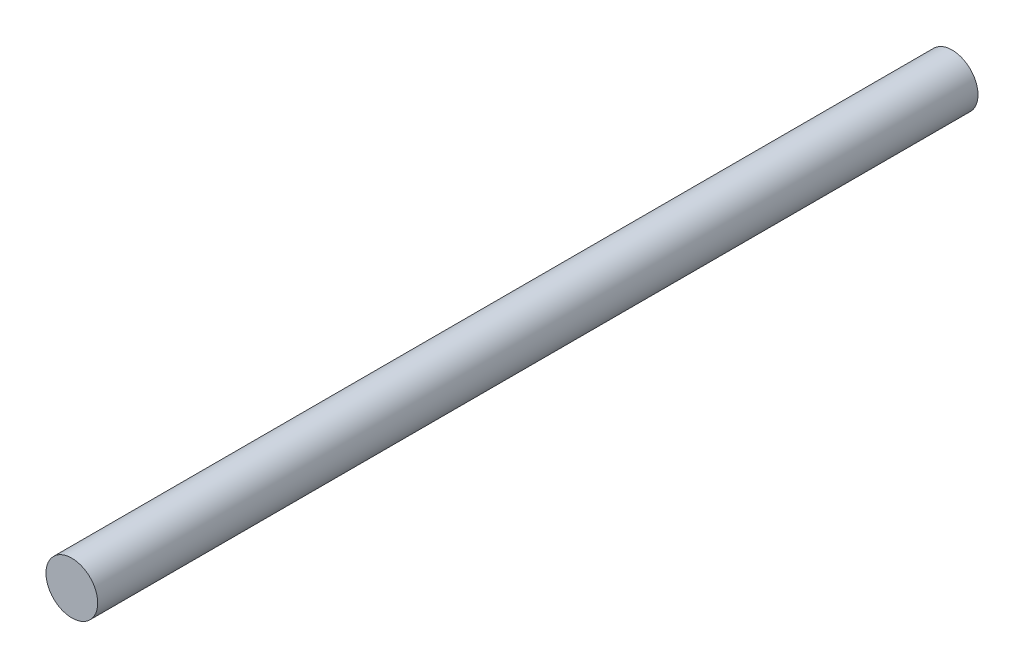
ISO-10303-21;
HEADER;
FILE_DESCRIPTION(('STEP AP214'),'2;1');
FILE_NAME('part.step','',(''),(''),'','','');
FILE_SCHEMA(('AUTOMOTIVE_DESIGN { 1 0 10303 214 1 1 1 1 }'));
ENDSEC;
DATA;
#1=APPLICATION_CONTEXT('core data for automotive mechanical design processes');
#2=APPLICATION_PROTOCOL_DEFINITION('international standard','automotive_design',2000,#1);
#3=PRODUCT_CONTEXT('',#1,'mechanical');
#4=PRODUCT('Part','Part','',(#3));
#5=PRODUCT_RELATED_PRODUCT_CATEGORY('part','',(#4));
#6=PRODUCT_DEFINITION_FORMATION('','',#4);
#7=PRODUCT_DEFINITION_CONTEXT('part definition',#1,'design');
#8=PRODUCT_DEFINITION('design','',#6,#7);
#9=PRODUCT_DEFINITION_SHAPE('','',#8);
#10=(LENGTH_UNIT() NAMED_UNIT(*) SI_UNIT(.MILLI.,.METRE.));
#11=(NAMED_UNIT(*) PLANE_ANGLE_UNIT() SI_UNIT($,.RADIAN.));
#12=(NAMED_UNIT(*) SI_UNIT($,.STERADIAN.) SOLID_ANGLE_UNIT());
#13=UNCERTAINTY_MEASURE_WITH_UNIT(LENGTH_MEASURE(1.E-05),#10,'distance_accuracy_value','');
#14=(GEOMETRIC_REPRESENTATION_CONTEXT(3) GLOBAL_UNCERTAINTY_ASSIGNED_CONTEXT((#13)) GLOBAL_UNIT_ASSIGNED_CONTEXT((#10,
#11,#12)) REPRESENTATION_CONTEXT('',''));
#15=CARTESIAN_POINT('',(0.,0.,0.));
#16=DIRECTION('',(0.,0.,1.));
#17=DIRECTION('',(1.,0.,0.));
#18=AXIS2_PLACEMENT_3D('',#15,#16,#17);
#19=CARTESIAN_POINT('',(0.,0.,85.));
#20=DIRECTION('',(0.,0.,-1.));
#21=DIRECTION('',(-1.,0.,0.));
#22=AXIS2_PLACEMENT_3D('',#19,#20,#21);
#23=CYLINDRICAL_SURFACE('',#22,2.5);
#24=CARTESIAN_POINT('',(0.,0.,85.));
#25=DIRECTION('',(0.,0.,1.));
#26=DIRECTION('',(1.,0.,0.));
#27=AXIS2_PLACEMENT_3D('',#24,#25,#26);
#28=CIRCLE('',#27,2.5);
#29=CARTESIAN_POINT('',(2.5,0.,85.));
#30=VERTEX_POINT('',#29);
#31=EDGE_CURVE('E10',#30,#30,#28,.T.);
#32=ORIENTED_EDGE('',*,*,#31,.F.);
#33=EDGE_LOOP('',(#32));
#34=FACE_BOUND('',#33,.T.);
#35=CARTESIAN_POINT('',(0.,0.,0.));
#36=DIRECTION('',(0.,0.,1.));
#37=DIRECTION('',(1.,0.,0.));
#38=AXIS2_PLACEMENT_3D('',#35,#36,#37);
#39=CIRCLE('',#38,2.5);
#40=CARTESIAN_POINT('',(2.5,0.,0.));
#41=VERTEX_POINT('',#40);
#42=EDGE_CURVE('E39',#41,#41,#39,.T.);
#43=ORIENTED_EDGE('',*,*,#42,.T.);
#44=EDGE_LOOP('',(#43));
#45=FACE_BOUND('',#44,.T.);
#46=ADVANCED_FACE('F36',(#34,#45),#23,.T.);
#47=CARTESIAN_POINT('',(0.,0.,85.));
#48=DIRECTION('',(0.,0.,1.));
#49=DIRECTION('',(1.,0.,0.));
#50=AXIS2_PLACEMENT_3D('',#47,#48,#49);
#51=PLANE('',#50);
#52=ORIENTED_EDGE('',*,*,#31,.T.);
#53=EDGE_LOOP('',(#52));
#54=FACE_BOUND('',#53,.T.);
#55=ADVANCED_FACE('F51',(#54),#51,.T.);
#56=CARTESIAN_POINT('',(0.,0.,0.));
#57=DIRECTION('',(0.,0.,1.));
#58=DIRECTION('',(1.,0.,0.));
#59=AXIS2_PLACEMENT_3D('',#56,#57,#58);
#60=PLANE('',#59);
#61=ORIENTED_EDGE('',*,*,#42,.F.);
#62=EDGE_LOOP('',(#61));
#63=FACE_BOUND('',#62,.T.);
#64=ADVANCED_FACE('F49',(#63),#60,.F.);
#65=CLOSED_SHELL('',(#46,#55,#64));
#66=MANIFOLD_SOLID_BREP('B2',#65);
#67=ADVANCED_BREP_SHAPE_REPRESENTATION('',(#18,#66),#14);
#68=SHAPE_DEFINITION_REPRESENTATION(#9,#67);
ENDSEC;
END-ISO-10303-21;
